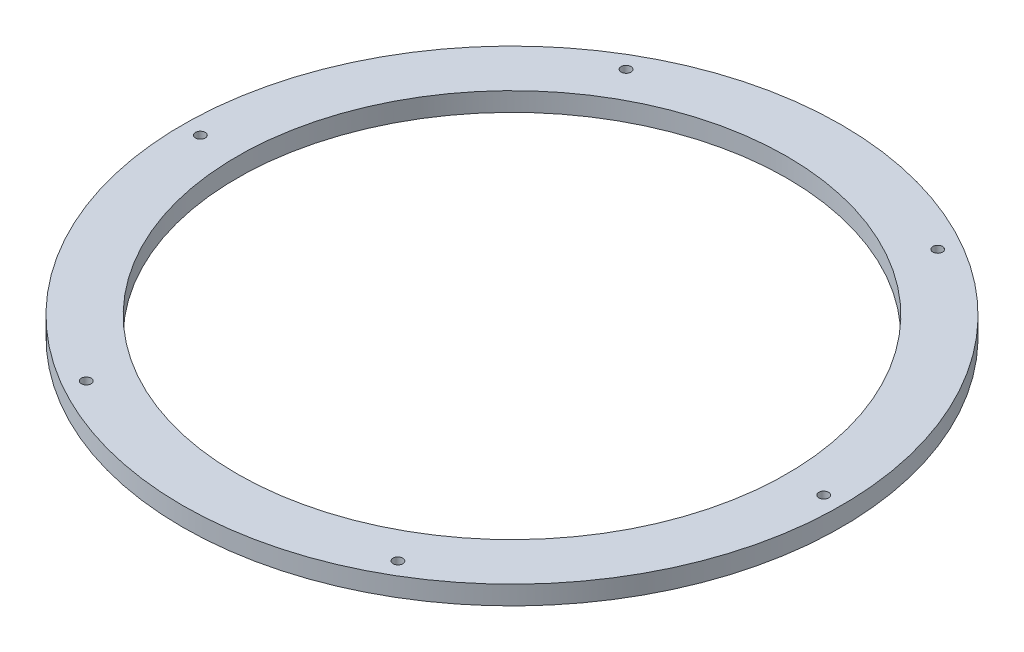
ISO-10303-21;
HEADER;
FILE_DESCRIPTION(('STEP AP214'),'2;1');
FILE_NAME('part.step','',(''),(''),'','','');
FILE_SCHEMA(('AUTOMOTIVE_DESIGN { 1 0 10303 214 1 1 1 1 }'));
ENDSEC;
DATA;
#1=APPLICATION_CONTEXT('core data for automotive mechanical design processes');
#2=APPLICATION_PROTOCOL_DEFINITION('international standard','automotive_design',2000,#1);
#3=PRODUCT_CONTEXT('',#1,'mechanical');
#4=PRODUCT('Part','Part','',(#3));
#5=PRODUCT_RELATED_PRODUCT_CATEGORY('part','',(#4));
#6=PRODUCT_DEFINITION_FORMATION('','',#4);
#7=PRODUCT_DEFINITION_CONTEXT('part definition',#1,'design');
#8=PRODUCT_DEFINITION('design','',#6,#7);
#9=PRODUCT_DEFINITION_SHAPE('','',#8);
#10=(LENGTH_UNIT() NAMED_UNIT(*) SI_UNIT(.MILLI.,.METRE.));
#11=(NAMED_UNIT(*) PLANE_ANGLE_UNIT() SI_UNIT($,.RADIAN.));
#12=(NAMED_UNIT(*) SI_UNIT($,.STERADIAN.) SOLID_ANGLE_UNIT());
#13=UNCERTAINTY_MEASURE_WITH_UNIT(LENGTH_MEASURE(1.E-05),#10,'distance_accuracy_value','');
#14=(GEOMETRIC_REPRESENTATION_CONTEXT(3) GLOBAL_UNCERTAINTY_ASSIGNED_CONTEXT((#13)) GLOBAL_UNIT_ASSIGNED_CONTEXT((#10,
#11,#12)) REPRESENTATION_CONTEXT('',''));
#15=CARTESIAN_POINT('',(0.,0.,0.));
#16=DIRECTION('',(0.,0.,1.));
#17=DIRECTION('',(1.,0.,0.));
#18=AXIS2_PLACEMENT_3D('',#15,#16,#17);
#19=CARTESIAN_POINT('',(0.,10.,0.));
#20=DIRECTION('',(0.,1.,0.));
#21=DIRECTION('',(0.,0.,1.));
#22=AXIS2_PLACEMENT_3D('',#19,#20,#21);
#23=PLANE('',#22);
#24=CARTESIAN_POINT('',(-82.7500000000016,10.,-143.327204326324));
#25=DIRECTION('',(0.,1.,0.));
#26=DIRECTION('',(-0.866025403784433,0.,0.50000000000001));
#27=AXIS2_PLACEMENT_3D('',#24,#25,#26);
#28=CIRCLE('',#27,2.59999999999999);
#29=CARTESIAN_POINT('',(-85.0016660498411,10.,-142.027204326324));
#30=VERTEX_POINT('',#29);
#31=EDGE_CURVE('E66',#30,#30,#28,.T.);
#32=ORIENTED_EDGE('',*,*,#31,.F.);
#33=EDGE_LOOP('',(#32));
#34=FACE_BOUND('',#33,.T.);
#35=CARTESIAN_POINT('',(82.7499999999986,10.,-143.327204326325));
#36=DIRECTION('',(0.,1.,0.));
#37=DIRECTION('',(-0.866025403784443,0.,-0.499999999999992));
#38=AXIS2_PLACEMENT_3D('',#35,#36,#37);
#39=CIRCLE('',#38,2.59999999999999);
#40=CARTESIAN_POINT('',(80.4983339501591,10.,-144.627204326325));
#41=VERTEX_POINT('',#40);
#42=EDGE_CURVE('E72',#41,#41,#39,.T.);
#43=ORIENTED_EDGE('',*,*,#42,.F.);
#44=EDGE_LOOP('',(#43));
#45=FACE_BOUND('',#44,.T.);
#46=CARTESIAN_POINT('',(165.5,10.,0.));
#47=DIRECTION('',(0.,1.,0.));
#48=DIRECTION('',(0.,0.,-1.));
#49=AXIS2_PLACEMENT_3D('',#46,#47,#48);
#50=CIRCLE('',#49,2.59999999999999);
#51=CARTESIAN_POINT('',(165.5,10.,-2.59999999999999));
#52=VERTEX_POINT('',#51);
#53=EDGE_CURVE('E78',#52,#52,#50,.T.);
#54=ORIENTED_EDGE('',*,*,#53,.F.);
#55=EDGE_LOOP('',(#54));
#56=FACE_BOUND('',#55,.T.);
#57=CARTESIAN_POINT('',(82.7500000000006,10.,143.327204326324));
#58=DIRECTION('',(0.,1.,0.));
#59=DIRECTION('',(0.866025403784436,0.,-0.500000000000004));
#60=AXIS2_PLACEMENT_3D('',#57,#58,#59);
#61=CIRCLE('',#60,2.59999999999999);
#62=CARTESIAN_POINT('',(85.0016660498402,10.,142.027204326324));
#63=VERTEX_POINT('',#62);
#64=EDGE_CURVE('E84',#63,#63,#61,.T.);
#65=ORIENTED_EDGE('',*,*,#64,.F.);
#66=EDGE_LOOP('',(#65));
#67=FACE_BOUND('',#66,.T.);
#68=CARTESIAN_POINT('',(-82.7499999999996,10.,143.327204326325));
#69=DIRECTION('',(0.,1.,0.));
#70=DIRECTION('',(0.86602540378444,0.,0.499999999999998));
#71=AXIS2_PLACEMENT_3D('',#68,#69,#70);
#72=CIRCLE('',#71,2.59999999999999);
#73=CARTESIAN_POINT('',(-80.4983339501601,10.,144.627204326325));
#74=VERTEX_POINT('',#73);
#75=EDGE_CURVE('E60',#74,#74,#72,.T.);
#76=ORIENTED_EDGE('',*,*,#75,.F.);
#77=EDGE_LOOP('',(#76));
#78=FACE_BOUND('',#77,.T.);
#79=CARTESIAN_POINT('',(-165.5,10.,0.));
#80=DIRECTION('',(0.,1.,0.));
#81=DIRECTION('',(0.,0.,1.));
#82=AXIS2_PLACEMENT_3D('',#79,#80,#81);
#83=CIRCLE('',#82,2.59999999999999);
#84=CARTESIAN_POINT('',(-165.5,10.,2.59999999999999));
#85=VERTEX_POINT('',#84);
#86=EDGE_CURVE('E54',#85,#85,#83,.T.);
#87=ORIENTED_EDGE('',*,*,#86,.F.);
#88=EDGE_LOOP('',(#87));
#89=FACE_BOUND('',#88,.T.);
#90=CARTESIAN_POINT('',(0.,10.,0.));
#91=DIRECTION('',(0.,1.,0.));
#92=DIRECTION('',(0.,0.,1.));
#93=AXIS2_PLACEMENT_3D('',#90,#91,#92);
#94=CIRCLE('',#93,175.);
#95=CARTESIAN_POINT('',(0.,10.,175.));
#96=VERTEX_POINT('',#95);
#97=EDGE_CURVE('E10',#96,#96,#94,.T.);
#98=ORIENTED_EDGE('',*,*,#97,.T.);
#99=EDGE_LOOP('',(#98));
#100=FACE_BOUND('',#99,.T.);
#101=CARTESIAN_POINT('',(0.,10.,0.));
#102=DIRECTION('',(0.,1.,0.));
#103=DIRECTION('',(0.,0.,1.));
#104=AXIS2_PLACEMENT_3D('',#101,#102,#103);
#105=CIRCLE('',#104,146.);
#106=CARTESIAN_POINT('',(0.,10.,146.));
#107=VERTEX_POINT('',#106);
#108=EDGE_CURVE('E46',#107,#107,#105,.T.);
#109=ORIENTED_EDGE('',*,*,#108,.F.);
#110=EDGE_LOOP('',(#109));
#111=FACE_BOUND('',#110,.T.);
#112=ADVANCED_FACE('F35',(#34,#45,#56,#67,#78,#89,#100,#111),#23,.T.);
#113=CARTESIAN_POINT('',(0.,0.,0.));
#114=DIRECTION('',(0.,1.,0.));
#115=DIRECTION('',(0.,0.,1.));
#116=AXIS2_PLACEMENT_3D('',#113,#114,#115);
#117=PLANE('',#116);
#118=CARTESIAN_POINT('',(-82.7500000000016,0.,-143.327204326324));
#119=DIRECTION('',(0.,1.,0.));
#120=DIRECTION('',(-0.866025403784433,0.,0.50000000000001));
#121=AXIS2_PLACEMENT_3D('',#118,#119,#120);
#122=CIRCLE('',#121,2.59999999999999);
#123=CARTESIAN_POINT('',(-85.0016660498411,0.,-142.027204326324));
#124=VERTEX_POINT('',#123);
#125=EDGE_CURVE('E69',#124,#124,#122,.T.);
#126=ORIENTED_EDGE('',*,*,#125,.T.);
#127=EDGE_LOOP('',(#126));
#128=FACE_BOUND('',#127,.T.);
#129=CARTESIAN_POINT('',(82.7499999999986,0.,-143.327204326325));
#130=DIRECTION('',(0.,1.,0.));
#131=DIRECTION('',(-0.866025403784443,0.,-0.499999999999992));
#132=AXIS2_PLACEMENT_3D('',#129,#130,#131);
#133=CIRCLE('',#132,2.59999999999999);
#134=CARTESIAN_POINT('',(80.4983339501591,0.,-144.627204326325));
#135=VERTEX_POINT('',#134);
#136=EDGE_CURVE('E75',#135,#135,#133,.T.);
#137=ORIENTED_EDGE('',*,*,#136,.T.);
#138=EDGE_LOOP('',(#137));
#139=FACE_BOUND('',#138,.T.);
#140=CARTESIAN_POINT('',(165.5,0.,0.));
#141=DIRECTION('',(0.,1.,0.));
#142=DIRECTION('',(0.,0.,-1.));
#143=AXIS2_PLACEMENT_3D('',#140,#141,#142);
#144=CIRCLE('',#143,2.59999999999999);
#145=CARTESIAN_POINT('',(165.5,0.,-2.59999999999999));
#146=VERTEX_POINT('',#145);
#147=EDGE_CURVE('E81',#146,#146,#144,.T.);
#148=ORIENTED_EDGE('',*,*,#147,.T.);
#149=EDGE_LOOP('',(#148));
#150=FACE_BOUND('',#149,.T.);
#151=CARTESIAN_POINT('',(82.7500000000006,0.,143.327204326324));
#152=DIRECTION('',(0.,1.,0.));
#153=DIRECTION('',(0.866025403784436,0.,-0.500000000000004));
#154=AXIS2_PLACEMENT_3D('',#151,#152,#153);
#155=CIRCLE('',#154,2.59999999999999);
#156=CARTESIAN_POINT('',(85.0016660498402,0.,142.027204326324));
#157=VERTEX_POINT('',#156);
#158=EDGE_CURVE('E63',#157,#157,#155,.T.);
#159=ORIENTED_EDGE('',*,*,#158,.T.);
#160=EDGE_LOOP('',(#159));
#161=FACE_BOUND('',#160,.T.);
#162=CARTESIAN_POINT('',(-82.7499999999996,0.,143.327204326325));
#163=DIRECTION('',(0.,1.,0.));
#164=DIRECTION('',(0.86602540378444,0.,0.499999999999998));
#165=AXIS2_PLACEMENT_3D('',#162,#163,#164);
#166=CIRCLE('',#165,2.59999999999999);
#167=CARTESIAN_POINT('',(-80.4983339501601,0.,144.627204326325));
#168=VERTEX_POINT('',#167);
#169=EDGE_CURVE('E57',#168,#168,#166,.T.);
#170=ORIENTED_EDGE('',*,*,#169,.T.);
#171=EDGE_LOOP('',(#170));
#172=FACE_BOUND('',#171,.T.);
#173=CARTESIAN_POINT('',(-165.5,0.,0.));
#174=DIRECTION('',(0.,1.,0.));
#175=DIRECTION('',(0.,0.,1.));
#176=AXIS2_PLACEMENT_3D('',#173,#174,#175);
#177=CIRCLE('',#176,2.59999999999999);
#178=CARTESIAN_POINT('',(-165.5,0.,2.59999999999999));
#179=VERTEX_POINT('',#178);
#180=EDGE_CURVE('E51',#179,#179,#177,.T.);
#181=ORIENTED_EDGE('',*,*,#180,.T.);
#182=EDGE_LOOP('',(#181));
#183=FACE_BOUND('',#182,.T.);
#184=CARTESIAN_POINT('',(0.,0.,0.));
#185=DIRECTION('',(0.,1.,0.));
#186=DIRECTION('',(0.,0.,1.));
#187=AXIS2_PLACEMENT_3D('',#184,#185,#186);
#188=CIRCLE('',#187,175.);
#189=CARTESIAN_POINT('',(0.,0.,175.));
#190=VERTEX_POINT('',#189);
#191=EDGE_CURVE('E39',#190,#190,#188,.T.);
#192=ORIENTED_EDGE('',*,*,#191,.F.);
#193=EDGE_LOOP('',(#192));
#194=FACE_BOUND('',#193,.T.);
#195=CARTESIAN_POINT('',(0.,0.,0.));
#196=DIRECTION('',(0.,1.,0.));
#197=DIRECTION('',(0.,0.,1.));
#198=AXIS2_PLACEMENT_3D('',#195,#196,#197);
#199=CIRCLE('',#198,146.);
#200=CARTESIAN_POINT('',(0.,0.,146.));
#201=VERTEX_POINT('',#200);
#202=EDGE_CURVE('E48',#201,#201,#199,.T.);
#203=ORIENTED_EDGE('',*,*,#202,.T.);
#204=EDGE_LOOP('',(#203));
#205=FACE_BOUND('',#204,.T.);
#206=ADVANCED_FACE('F90',(#128,#139,#150,#161,#172,#183,#194,#205),#117,.F.);
#207=CARTESIAN_POINT('',(0.,10.,0.));
#208=DIRECTION('',(0.,-1.,0.));
#209=DIRECTION('',(0.,0.,-1.));
#210=AXIS2_PLACEMENT_3D('',#207,#208,#209);
#211=CYLINDRICAL_SURFACE('',#210,175.);
#212=ORIENTED_EDGE('',*,*,#97,.F.);
#213=EDGE_LOOP('',(#212));
#214=FACE_BOUND('',#213,.T.);
#215=ORIENTED_EDGE('',*,*,#191,.T.);
#216=EDGE_LOOP('',(#215));
#217=FACE_BOUND('',#216,.T.);
#218=ADVANCED_FACE('F37',(#214,#217),#211,.T.);
#219=CARTESIAN_POINT('',(0.,10.,0.));
#220=DIRECTION('',(0.,-1.,0.));
#221=DIRECTION('',(0.,0.,-1.));
#222=AXIS2_PLACEMENT_3D('',#219,#220,#221);
#223=CYLINDRICAL_SURFACE('',#222,146.);
#224=ORIENTED_EDGE('',*,*,#108,.T.);
#225=EDGE_LOOP('',(#224));
#226=FACE_BOUND('',#225,.T.);
#227=ORIENTED_EDGE('',*,*,#202,.F.);
#228=EDGE_LOOP('',(#227));
#229=FACE_BOUND('',#228,.T.);
#230=ADVANCED_FACE('F111',(#226,#229),#223,.F.);
#231=CARTESIAN_POINT('',(-165.5,0.,0.));
#232=DIRECTION('',(0.,1.,0.));
#233=DIRECTION('',(0.,0.,1.));
#234=AXIS2_PLACEMENT_3D('',#231,#232,#233);
#235=CYLINDRICAL_SURFACE('',#234,2.59999999999999);
#236=ORIENTED_EDGE('',*,*,#180,.F.);
#237=EDGE_LOOP('',(#236));
#238=FACE_BOUND('',#237,.T.);
#239=ORIENTED_EDGE('',*,*,#86,.T.);
#240=EDGE_LOOP('',(#239));
#241=FACE_BOUND('',#240,.T.);
#242=ADVANCED_FACE('F114',(#238,#241),#235,.F.);
#243=CARTESIAN_POINT('',(-82.7499999999996,0.,143.327204326325));
#244=DIRECTION('',(0.,1.,0.));
#245=DIRECTION('',(0.,0.,1.));
#246=AXIS2_PLACEMENT_3D('',#243,#244,#245);
#247=CYLINDRICAL_SURFACE('',#246,2.59999999999999);
#248=ORIENTED_EDGE('',*,*,#169,.F.);
#249=EDGE_LOOP('',(#248));
#250=FACE_BOUND('',#249,.T.);
#251=ORIENTED_EDGE('',*,*,#75,.T.);
#252=EDGE_LOOP('',(#251));
#253=FACE_BOUND('',#252,.T.);
#254=ADVANCED_FACE('F97',(#250,#253),#247,.F.);
#255=CARTESIAN_POINT('',(82.7500000000006,0.,143.327204326324));
#256=DIRECTION('',(0.,1.,0.));
#257=DIRECTION('',(0.,0.,1.));
#258=AXIS2_PLACEMENT_3D('',#255,#256,#257);
#259=CYLINDRICAL_SURFACE('',#258,2.59999999999999);
#260=ORIENTED_EDGE('',*,*,#158,.F.);
#261=EDGE_LOOP('',(#260));
#262=FACE_BOUND('',#261,.T.);
#263=ORIENTED_EDGE('',*,*,#64,.T.);
#264=EDGE_LOOP('',(#263));
#265=FACE_BOUND('',#264,.T.);
#266=ADVANCED_FACE('F93',(#262,#265),#259,.F.);
#267=CARTESIAN_POINT('',(165.5,0.,0.));
#268=DIRECTION('',(0.,1.,0.));
#269=DIRECTION('',(0.,0.,1.));
#270=AXIS2_PLACEMENT_3D('',#267,#268,#269);
#271=CYLINDRICAL_SURFACE('',#270,2.59999999999999);
#272=ORIENTED_EDGE('',*,*,#147,.F.);
#273=EDGE_LOOP('',(#272));
#274=FACE_BOUND('',#273,.T.);
#275=ORIENTED_EDGE('',*,*,#53,.T.);
#276=EDGE_LOOP('',(#275));
#277=FACE_BOUND('',#276,.T.);
#278=ADVANCED_FACE('F96',(#274,#277),#271,.F.);
#279=CARTESIAN_POINT('',(82.7499999999986,0.,-143.327204326325));
#280=DIRECTION('',(0.,1.,0.));
#281=DIRECTION('',(0.,0.,1.));
#282=AXIS2_PLACEMENT_3D('',#279,#280,#281);
#283=CYLINDRICAL_SURFACE('',#282,2.59999999999999);
#284=ORIENTED_EDGE('',*,*,#136,.F.);
#285=EDGE_LOOP('',(#284));
#286=FACE_BOUND('',#285,.T.);
#287=ORIENTED_EDGE('',*,*,#42,.T.);
#288=EDGE_LOOP('',(#287));
#289=FACE_BOUND('',#288,.T.);
#290=ADVANCED_FACE('F135',(#286,#289),#283,.F.);
#291=CARTESIAN_POINT('',(-82.7500000000016,0.,-143.327204326324));
#292=DIRECTION('',(0.,1.,0.));
#293=DIRECTION('',(0.,0.,1.));
#294=AXIS2_PLACEMENT_3D('',#291,#292,#293);
#295=CYLINDRICAL_SURFACE('',#294,2.59999999999999);
#296=ORIENTED_EDGE('',*,*,#125,.F.);
#297=EDGE_LOOP('',(#296));
#298=FACE_BOUND('',#297,.T.);
#299=ORIENTED_EDGE('',*,*,#31,.T.);
#300=EDGE_LOOP('',(#299));
#301=FACE_BOUND('',#300,.T.);
#302=ADVANCED_FACE('F132',(#298,#301),#295,.F.);
#303=CLOSED_SHELL('',(#112,#206,#218,#230,#242,#254,#266,#278,#290,#302));
#304=MANIFOLD_SOLID_BREP('B2',#303);
#305=ADVANCED_BREP_SHAPE_REPRESENTATION('',(#18,#304),#14);
#306=SHAPE_DEFINITION_REPRESENTATION(#9,#305);
ENDSEC;
END-ISO-10303-21;
